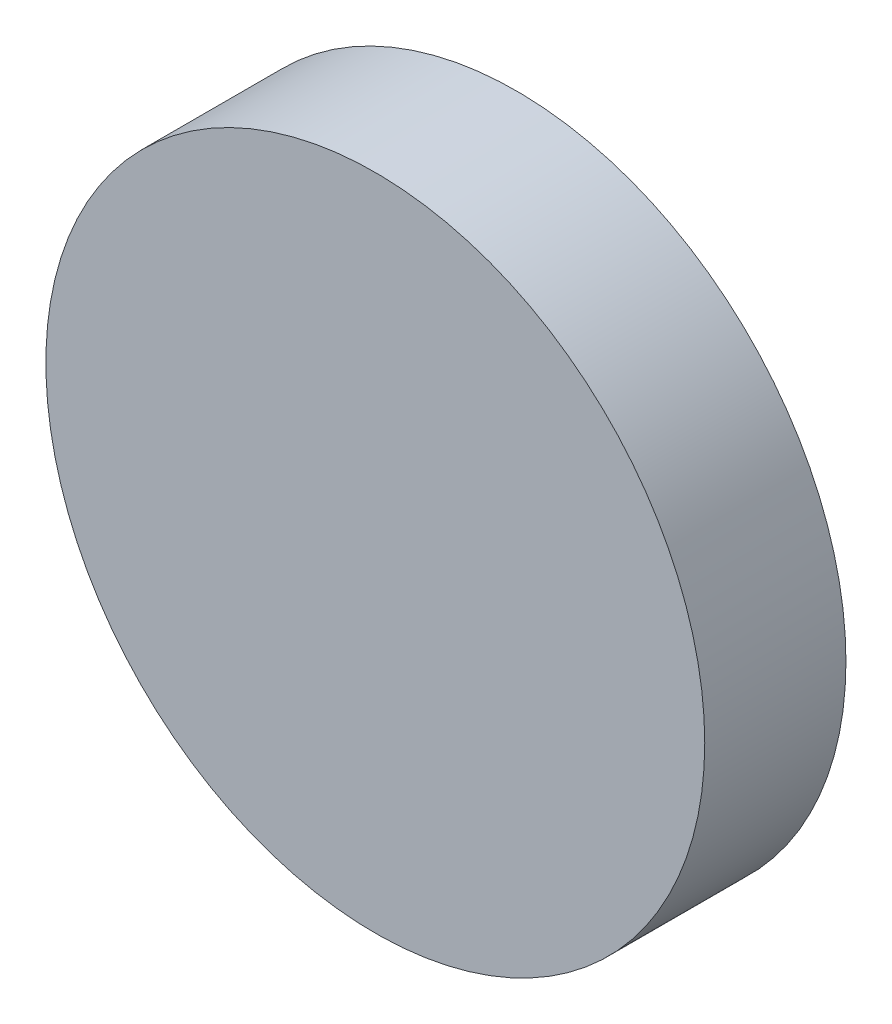
ISO-10303-21;
HEADER;
FILE_DESCRIPTION(('STEP AP214'),'2;1');
FILE_NAME('part.step','',(''),(''),'','','');
FILE_SCHEMA(('AUTOMOTIVE_DESIGN { 1 0 10303 214 1 1 1 1 }'));
ENDSEC;
DATA;
#1=APPLICATION_CONTEXT('core data for automotive mechanical design processes');
#2=APPLICATION_PROTOCOL_DEFINITION('international standard','automotive_design',2000,#1);
#3=PRODUCT_CONTEXT('',#1,'mechanical');
#4=PRODUCT('Part','Part','',(#3));
#5=PRODUCT_RELATED_PRODUCT_CATEGORY('part','',(#4));
#6=PRODUCT_DEFINITION_FORMATION('','',#4);
#7=PRODUCT_DEFINITION_CONTEXT('part definition',#1,'design');
#8=PRODUCT_DEFINITION('design','',#6,#7);
#9=PRODUCT_DEFINITION_SHAPE('','',#8);
#10=(LENGTH_UNIT() NAMED_UNIT(*) SI_UNIT(.MILLI.,.METRE.));
#11=(NAMED_UNIT(*) PLANE_ANGLE_UNIT() SI_UNIT($,.RADIAN.));
#12=(NAMED_UNIT(*) SI_UNIT($,.STERADIAN.) SOLID_ANGLE_UNIT());
#13=UNCERTAINTY_MEASURE_WITH_UNIT(LENGTH_MEASURE(1.E-05),#10,'distance_accuracy_value','');
#14=(GEOMETRIC_REPRESENTATION_CONTEXT(3) GLOBAL_UNCERTAINTY_ASSIGNED_CONTEXT((#13)) GLOBAL_UNIT_ASSIGNED_CONTEXT((#10,
#11,#12)) REPRESENTATION_CONTEXT('',''));
#15=CARTESIAN_POINT('',(0.,0.,0.));
#16=DIRECTION('',(0.,0.,1.));
#17=DIRECTION('',(1.,0.,0.));
#18=AXIS2_PLACEMENT_3D('',#15,#16,#17);
#19=CARTESIAN_POINT('',(0.,0.,3.));
#20=DIRECTION('',(0.,0.,-1.));
#21=DIRECTION('',(-1.,0.,0.));
#22=AXIS2_PLACEMENT_3D('',#19,#20,#21);
#23=CYLINDRICAL_SURFACE('',#22,7.);
#24=CARTESIAN_POINT('',(0.,0.,3.));
#25=DIRECTION('',(0.,0.,1.));
#26=DIRECTION('',(1.,0.,0.));
#27=AXIS2_PLACEMENT_3D('',#24,#25,#26);
#28=CIRCLE('',#27,7.);
#29=CARTESIAN_POINT('',(7.,0.,3.));
#30=VERTEX_POINT('',#29);
#31=EDGE_CURVE('E10',#30,#30,#28,.T.);
#32=ORIENTED_EDGE('',*,*,#31,.F.);
#33=EDGE_LOOP('',(#32));
#34=FACE_BOUND('',#33,.T.);
#35=CARTESIAN_POINT('',(0.,0.,0.));
#36=DIRECTION('',(0.,0.,1.));
#37=DIRECTION('',(1.,0.,0.));
#38=AXIS2_PLACEMENT_3D('',#35,#36,#37);
#39=CIRCLE('',#38,7.);
#40=CARTESIAN_POINT('',(7.,0.,0.));
#41=VERTEX_POINT('',#40);
#42=EDGE_CURVE('E33',#41,#41,#39,.T.);
#43=ORIENTED_EDGE('',*,*,#42,.T.);
#44=EDGE_LOOP('',(#43));
#45=FACE_BOUND('',#44,.T.);
#46=ADVANCED_FACE('F30',(#34,#45),#23,.T.);
#47=CARTESIAN_POINT('',(0.,0.,3.));
#48=DIRECTION('',(0.,0.,1.));
#49=DIRECTION('',(1.,0.,0.));
#50=AXIS2_PLACEMENT_3D('',#47,#48,#49);
#51=PLANE('',#50);
#52=ORIENTED_EDGE('',*,*,#31,.T.);
#53=EDGE_LOOP('',(#52));
#54=FACE_BOUND('',#53,.T.);
#55=ADVANCED_FACE('F45',(#54),#51,.T.);
#56=CARTESIAN_POINT('',(0.,0.,0.));
#57=DIRECTION('',(0.,0.,1.));
#58=DIRECTION('',(1.,0.,0.));
#59=AXIS2_PLACEMENT_3D('',#56,#57,#58);
#60=PLANE('',#59);
#61=ORIENTED_EDGE('',*,*,#42,.F.);
#62=EDGE_LOOP('',(#61));
#63=FACE_BOUND('',#62,.T.);
#64=ADVANCED_FACE('F43',(#63),#60,.F.);
#65=CLOSED_SHELL('',(#46,#55,#64));
#66=MANIFOLD_SOLID_BREP('B2',#65);
#67=ADVANCED_BREP_SHAPE_REPRESENTATION('',(#18,#66),#14);
#68=SHAPE_DEFINITION_REPRESENTATION(#9,#67);
ENDSEC;
END-ISO-10303-21;
